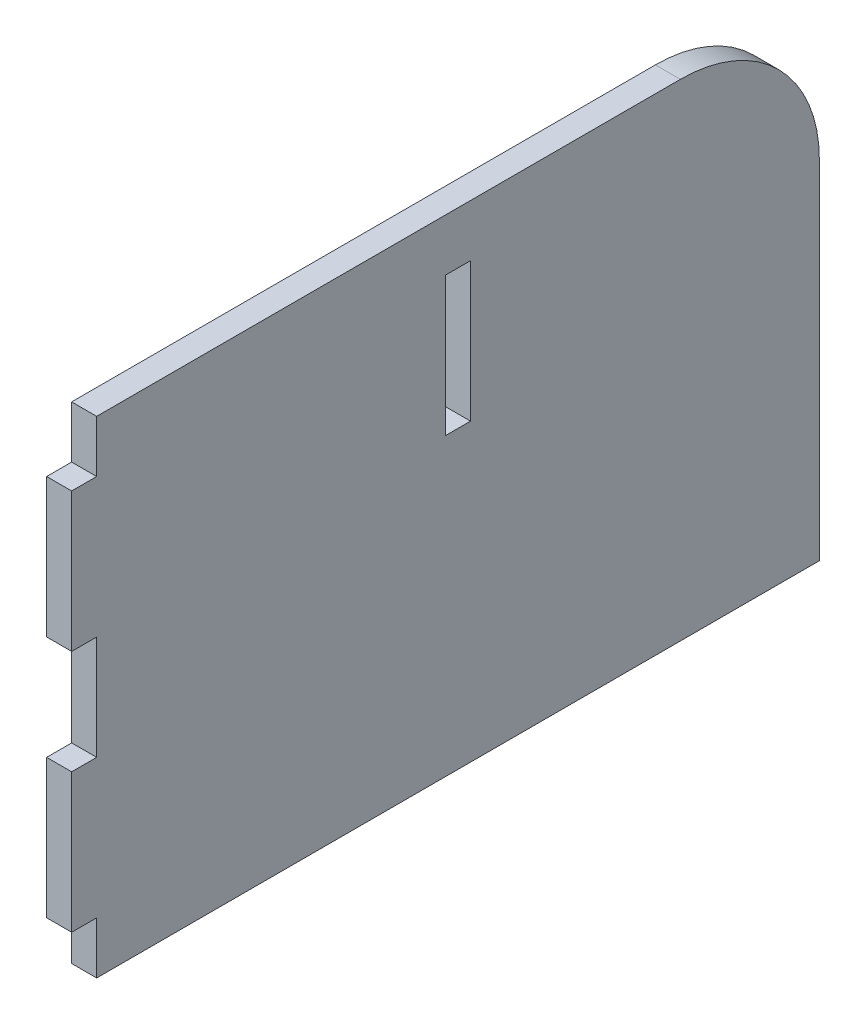
ISO-10303-21;
HEADER;
FILE_DESCRIPTION(('STEP AP214'),'2;1');
FILE_NAME('part.step','',(''),(''),'','','');
FILE_SCHEMA(('AUTOMOTIVE_DESIGN { 1 0 10303 214 1 1 1 1 }'));
ENDSEC;
DATA;
#1=APPLICATION_CONTEXT('core data for automotive mechanical design processes');
#2=APPLICATION_PROTOCOL_DEFINITION('international standard','automotive_design',2000,#1);
#3=PRODUCT_CONTEXT('',#1,'mechanical');
#4=PRODUCT('Part','Part','',(#3));
#5=PRODUCT_RELATED_PRODUCT_CATEGORY('part','',(#4));
#6=PRODUCT_DEFINITION_FORMATION('','',#4);
#7=PRODUCT_DEFINITION_CONTEXT('part definition',#1,'design');
#8=PRODUCT_DEFINITION('design','',#6,#7);
#9=PRODUCT_DEFINITION_SHAPE('','',#8);
#10=(LENGTH_UNIT() NAMED_UNIT(*) SI_UNIT(.MILLI.,.METRE.));
#11=(NAMED_UNIT(*) PLANE_ANGLE_UNIT() SI_UNIT($,.RADIAN.));
#12=(NAMED_UNIT(*) SI_UNIT($,.STERADIAN.) SOLID_ANGLE_UNIT());
#13=UNCERTAINTY_MEASURE_WITH_UNIT(LENGTH_MEASURE(1.E-05),#10,'distance_accuracy_value','');
#14=(GEOMETRIC_REPRESENTATION_CONTEXT(3) GLOBAL_UNCERTAINTY_ASSIGNED_CONTEXT((#13)) GLOBAL_UNIT_ASSIGNED_CONTEXT((#10,
#11,#12)) REPRESENTATION_CONTEXT('',''));
#15=CARTESIAN_POINT('',(0.,0.,0.));
#16=DIRECTION('',(0.,0.,1.));
#17=DIRECTION('',(1.,0.,0.));
#18=AXIS2_PLACEMENT_3D('',#15,#16,#17);
#19=CARTESIAN_POINT('',(18.,-100.,-420.));
#20=DIRECTION('',(1.,0.,0.));
#21=DIRECTION('',(0.,0.,-1.));
#22=AXIS2_PLACEMENT_3D('',#19,#20,#21);
#23=PLANE('',#22);
#24=DIRECTION('',(0.,-1.,0.));
#25=VECTOR('',#24,1.);
#26=CARTESIAN_POINT('',(18.,0.,0.));
#27=LINE('',#26,#25);
#28=CARTESIAN_POINT('',(18.,0.,0.));
#29=VERTEX_POINT('',#28);
#30=CARTESIAN_POINT('',(18.,-37.5,0.));
#31=VERTEX_POINT('',#30);
#32=EDGE_CURVE('E188',#29,#31,#27,.T.);
#33=ORIENTED_EDGE('',*,*,#32,.T.);
#34=DIRECTION('',(0.,0.,1.));
#35=VECTOR('',#34,1.);
#36=CARTESIAN_POINT('',(18.,-37.5,18.));
#37=LINE('',#36,#35);
#38=CARTESIAN_POINT('',(18.,-37.5,18.));
#39=VERTEX_POINT('',#38);
#40=EDGE_CURVE('E191',#31,#39,#37,.T.);
#41=ORIENTED_EDGE('',*,*,#40,.T.);
#42=DIRECTION('',(0.,-1.,0.));
#43=VECTOR('',#42,1.);
#44=CARTESIAN_POINT('',(18.,-37.5,18.));
#45=LINE('',#44,#43);
#46=CARTESIAN_POINT('',(18.,-137.5,18.));
#47=VERTEX_POINT('',#46);
#48=EDGE_CURVE('E194',#39,#47,#45,.T.);
#49=ORIENTED_EDGE('',*,*,#48,.T.);
#50=DIRECTION('',(0.,0.,-1.));
#51=VECTOR('',#50,1.);
#52=CARTESIAN_POINT('',(18.,-137.5,18.));
#53=LINE('',#52,#51);
#54=CARTESIAN_POINT('',(18.,-137.5,0.));
#55=VERTEX_POINT('',#54);
#56=EDGE_CURVE('E196',#47,#55,#53,.T.);
#57=ORIENTED_EDGE('',*,*,#56,.T.);
#58=DIRECTION('',(0.,-1.,0.));
#59=VECTOR('',#58,1.);
#60=CARTESIAN_POINT('',(18.,-137.5,0.));
#61=LINE('',#60,#59);
#62=CARTESIAN_POINT('',(18.,-212.5,0.));
#63=VERTEX_POINT('',#62);
#64=EDGE_CURVE('E198',#55,#63,#61,.T.);
#65=ORIENTED_EDGE('',*,*,#64,.T.);
#66=DIRECTION('',(0.,0.,1.));
#67=VECTOR('',#66,1.);
#68=CARTESIAN_POINT('',(18.,-212.5,18.));
#69=LINE('',#68,#67);
#70=CARTESIAN_POINT('',(18.,-212.5,18.));
#71=VERTEX_POINT('',#70);
#72=EDGE_CURVE('E200',#63,#71,#69,.T.);
#73=ORIENTED_EDGE('',*,*,#72,.T.);
#74=DIRECTION('',(0.,-1.,0.));
#75=VECTOR('',#74,1.);
#76=CARTESIAN_POINT('',(18.,-312.5,18.));
#77=LINE('',#76,#75);
#78=CARTESIAN_POINT('',(18.,-312.5,18.));
#79=VERTEX_POINT('',#78);
#80=EDGE_CURVE('E202',#71,#79,#77,.T.);
#81=ORIENTED_EDGE('',*,*,#80,.T.);
#82=DIRECTION('',(0.,0.,-1.));
#83=VECTOR('',#82,1.);
#84=CARTESIAN_POINT('',(18.,-312.5,18.));
#85=LINE('',#84,#83);
#86=CARTESIAN_POINT('',(18.,-312.5,0.));
#87=VERTEX_POINT('',#86);
#88=EDGE_CURVE('E204',#79,#87,#85,.T.);
#89=ORIENTED_EDGE('',*,*,#88,.T.);
#90=DIRECTION('',(0.,-1.,0.));
#91=VECTOR('',#90,1.);
#92=CARTESIAN_POINT('',(18.,-312.5,0.));
#93=LINE('',#92,#91);
#94=CARTESIAN_POINT('',(18.,-350.,0.));
#95=VERTEX_POINT('',#94);
#96=EDGE_CURVE('E206',#87,#95,#93,.T.);
#97=ORIENTED_EDGE('',*,*,#96,.T.);
#98=DIRECTION('',(0.,0.,-1.));
#99=VECTOR('',#98,1.);
#100=CARTESIAN_POINT('',(18.,-350.,0.));
#101=LINE('',#100,#99);
#102=CARTESIAN_POINT('',(18.,-350.,-520.));
#103=VERTEX_POINT('',#102);
#104=EDGE_CURVE('E208',#95,#103,#101,.T.);
#105=ORIENTED_EDGE('',*,*,#104,.T.);
#106=DIRECTION('',(0.,1.,0.));
#107=VECTOR('',#106,1.);
#108=CARTESIAN_POINT('',(18.,-100.,-520.));
#109=LINE('',#108,#107);
#110=CARTESIAN_POINT('',(18.,-100.,-520.));
#111=VERTEX_POINT('',#110);
#112=EDGE_CURVE('E210',#103,#111,#109,.T.);
#113=ORIENTED_EDGE('',*,*,#112,.T.);
#114=CARTESIAN_POINT('',(18.,-100.,-420.));
#115=DIRECTION('',(1.,0.,0.));
#116=DIRECTION('',(0.,0.,-1.));
#117=AXIS2_PLACEMENT_3D('',#114,#115,#116);
#118=CIRCLE('',#117,100.);
#119=CARTESIAN_POINT('',(18.,0.,-420.));
#120=VERTEX_POINT('',#119);
#121=EDGE_CURVE('E212',#111,#120,#118,.T.);
#122=ORIENTED_EDGE('',*,*,#121,.T.);
#123=DIRECTION('',(0.,0.,1.));
#124=VECTOR('',#123,1.);
#125=CARTESIAN_POINT('',(18.,0.,0.));
#126=LINE('',#125,#124);
#127=EDGE_CURVE('E214',#120,#29,#126,.T.);
#128=ORIENTED_EDGE('',*,*,#127,.T.);
#129=EDGE_LOOP('',(#33,#41,#49,#57,#65,#73,#81,#89,#97,#105,#113,#122,#128));
#130=FACE_BOUND('',#129,.T.);
#131=DIRECTION('',(0.,0.,1.));
#132=VECTOR('',#131,1.);
#133=CARTESIAN_POINT('',(18.,-37.5000000000001,-251.));
#134=LINE('',#133,#132);
#135=CARTESIAN_POINT('',(18.,-37.5000000000001,-269.));
#136=VERTEX_POINT('',#135);
#137=CARTESIAN_POINT('',(18.,-37.5000000000001,-251.));
#138=VERTEX_POINT('',#137);
#139=EDGE_CURVE('E160',#136,#138,#134,.T.);
#140=ORIENTED_EDGE('',*,*,#139,.F.);
#141=DIRECTION('',(0.,1.,0.));
#142=VECTOR('',#141,1.);
#143=CARTESIAN_POINT('',(18.,-37.5000000000001,-269.));
#144=LINE('',#143,#142);
#145=CARTESIAN_POINT('',(18.,-137.5,-269.));
#146=VERTEX_POINT('',#145);
#147=EDGE_CURVE('E152',#146,#136,#144,.T.);
#148=ORIENTED_EDGE('',*,*,#147,.F.);
#149=DIRECTION('',(0.,0.,-1.));
#150=VECTOR('',#149,1.);
#151=CARTESIAN_POINT('',(18.,-137.5,-251.));
#152=LINE('',#151,#150);
#153=CARTESIAN_POINT('',(18.,-137.5,-251.));
#154=VERTEX_POINT('',#153);
#155=EDGE_CURVE('E174',#154,#146,#152,.T.);
#156=ORIENTED_EDGE('',*,*,#155,.F.);
#157=DIRECTION('',(0.,-1.,0.));
#158=VECTOR('',#157,1.);
#159=CARTESIAN_POINT('',(18.,-37.5000000000001,-251.));
#160=LINE('',#159,#158);
#161=EDGE_CURVE('E172',#138,#154,#160,.T.);
#162=ORIENTED_EDGE('',*,*,#161,.F.);
#163=EDGE_LOOP('',(#140,#148,#156,#162));
#164=FACE_BOUND('',#163,.T.);
#165=ADVANCED_FACE('F33',(#130,#164),#23,.T.);
#166=CARTESIAN_POINT('',(0.,-100.,-420.));
#167=DIRECTION('',(1.,0.,0.));
#168=DIRECTION('',(0.,0.,-1.));
#169=AXIS2_PLACEMENT_3D('',#166,#167,#168);
#170=PLANE('',#169);
#171=DIRECTION('',(0.,-1.,0.));
#172=VECTOR('',#171,1.);
#173=CARTESIAN_POINT('',(0.,0.,0.));
#174=LINE('',#173,#172);
#175=CARTESIAN_POINT('',(0.,0.,0.));
#176=VERTEX_POINT('',#175);
#177=CARTESIAN_POINT('',(0.,-37.5,0.));
#178=VERTEX_POINT('',#177);
#179=EDGE_CURVE('E168',#176,#178,#174,.T.);
#180=ORIENTED_EDGE('',*,*,#179,.F.);
#181=DIRECTION('',(0.,0.,1.));
#182=VECTOR('',#181,1.);
#183=CARTESIAN_POINT('',(0.,0.,0.));
#184=LINE('',#183,#182);
#185=CARTESIAN_POINT('',(0.,0.,-420.));
#186=VERTEX_POINT('',#185);
#187=EDGE_CURVE('E192',#186,#176,#184,.T.);
#188=ORIENTED_EDGE('',*,*,#187,.F.);
#189=CARTESIAN_POINT('',(0.,-100.,-420.));
#190=DIRECTION('',(1.,0.,0.));
#191=DIRECTION('',(0.,0.,-1.));
#192=AXIS2_PLACEMENT_3D('',#189,#190,#191);
#193=CIRCLE('',#192,100.);
#194=CARTESIAN_POINT('',(0.,-100.,-520.));
#195=VERTEX_POINT('',#194);
#196=EDGE_CURVE('E239',#195,#186,#193,.T.);
#197=ORIENTED_EDGE('',*,*,#196,.F.);
#198=DIRECTION('',(0.,1.,0.));
#199=VECTOR('',#198,1.);
#200=CARTESIAN_POINT('',(0.,-100.,-520.));
#201=LINE('',#200,#199);
#202=CARTESIAN_POINT('',(0.,-350.,-520.));
#203=VERTEX_POINT('',#202);
#204=EDGE_CURVE('E237',#203,#195,#201,.T.);
#205=ORIENTED_EDGE('',*,*,#204,.F.);
#206=DIRECTION('',(0.,0.,-1.));
#207=VECTOR('',#206,1.);
#208=CARTESIAN_POINT('',(0.,-350.,0.));
#209=LINE('',#208,#207);
#210=CARTESIAN_POINT('',(0.,-350.,0.));
#211=VERTEX_POINT('',#210);
#212=EDGE_CURVE('E235',#211,#203,#209,.T.);
#213=ORIENTED_EDGE('',*,*,#212,.F.);
#214=DIRECTION('',(0.,-1.,0.));
#215=VECTOR('',#214,1.);
#216=CARTESIAN_POINT('',(0.,-312.5,0.));
#217=LINE('',#216,#215);
#218=CARTESIAN_POINT('',(0.,-312.5,0.));
#219=VERTEX_POINT('',#218);
#220=EDGE_CURVE('E233',#219,#211,#217,.T.);
#221=ORIENTED_EDGE('',*,*,#220,.F.);
#222=DIRECTION('',(0.,0.,-1.));
#223=VECTOR('',#222,1.);
#224=CARTESIAN_POINT('',(0.,-312.5,18.));
#225=LINE('',#224,#223);
#226=CARTESIAN_POINT('',(0.,-312.5,18.));
#227=VERTEX_POINT('',#226);
#228=EDGE_CURVE('E231',#227,#219,#225,.T.);
#229=ORIENTED_EDGE('',*,*,#228,.F.);
#230=DIRECTION('',(0.,-1.,0.));
#231=VECTOR('',#230,1.);
#232=CARTESIAN_POINT('',(0.,-312.5,18.));
#233=LINE('',#232,#231);
#234=CARTESIAN_POINT('',(0.,-212.5,18.));
#235=VERTEX_POINT('',#234);
#236=EDGE_CURVE('E229',#235,#227,#233,.T.);
#237=ORIENTED_EDGE('',*,*,#236,.F.);
#238=DIRECTION('',(0.,0.,1.));
#239=VECTOR('',#238,1.);
#240=CARTESIAN_POINT('',(0.,-212.5,18.));
#241=LINE('',#240,#239);
#242=CARTESIAN_POINT('',(0.,-212.5,0.));
#243=VERTEX_POINT('',#242);
#244=EDGE_CURVE('E227',#243,#235,#241,.T.);
#245=ORIENTED_EDGE('',*,*,#244,.F.);
#246=DIRECTION('',(0.,-1.,0.));
#247=VECTOR('',#246,1.);
#248=CARTESIAN_POINT('',(0.,-137.5,0.));
#249=LINE('',#248,#247);
#250=CARTESIAN_POINT('',(0.,-137.5,0.));
#251=VERTEX_POINT('',#250);
#252=EDGE_CURVE('E225',#251,#243,#249,.T.);
#253=ORIENTED_EDGE('',*,*,#252,.F.);
#254=DIRECTION('',(0.,0.,-1.));
#255=VECTOR('',#254,1.);
#256=CARTESIAN_POINT('',(0.,-137.5,18.));
#257=LINE('',#256,#255);
#258=CARTESIAN_POINT('',(0.,-137.5,18.));
#259=VERTEX_POINT('',#258);
#260=EDGE_CURVE('E223',#259,#251,#257,.T.);
#261=ORIENTED_EDGE('',*,*,#260,.F.);
#262=DIRECTION('',(0.,-1.,0.));
#263=VECTOR('',#262,1.);
#264=CARTESIAN_POINT('',(0.,-37.5,18.));
#265=LINE('',#264,#263);
#266=CARTESIAN_POINT('',(0.,-37.5,18.));
#267=VERTEX_POINT('',#266);
#268=EDGE_CURVE('E221',#267,#259,#265,.T.);
#269=ORIENTED_EDGE('',*,*,#268,.F.);
#270=DIRECTION('',(0.,0.,1.));
#271=VECTOR('',#270,1.);
#272=CARTESIAN_POINT('',(0.,-37.5,18.));
#273=LINE('',#272,#271);
#274=EDGE_CURVE('E219',#178,#267,#273,.T.);
#275=ORIENTED_EDGE('',*,*,#274,.F.);
#276=EDGE_LOOP('',(#180,#188,#197,#205,#213,#221,#229,#237,#245,#253,#261,#269,#275));
#277=FACE_BOUND('',#276,.T.);
#278=DIRECTION('',(0.,1.,0.));
#279=VECTOR('',#278,1.);
#280=CARTESIAN_POINT('',(0.,-37.5000000000001,-269.));
#281=LINE('',#280,#279);
#282=CARTESIAN_POINT('',(0.,-137.5,-269.));
#283=VERTEX_POINT('',#282);
#284=CARTESIAN_POINT('',(0.,-37.5000000000001,-269.));
#285=VERTEX_POINT('',#284);
#286=EDGE_CURVE('E56',#283,#285,#281,.T.);
#287=ORIENTED_EDGE('',*,*,#286,.T.);
#288=DIRECTION('',(0.,0.,1.));
#289=VECTOR('',#288,1.);
#290=CARTESIAN_POINT('',(0.,-37.5000000000001,-251.));
#291=LINE('',#290,#289);
#292=CARTESIAN_POINT('',(0.,-37.5000000000001,-251.));
#293=VERTEX_POINT('',#292);
#294=EDGE_CURVE('E167',#285,#293,#291,.T.);
#295=ORIENTED_EDGE('',*,*,#294,.T.);
#296=DIRECTION('',(0.,-1.,0.));
#297=VECTOR('',#296,1.);
#298=CARTESIAN_POINT('',(0.,-37.5000000000001,-251.));
#299=LINE('',#298,#297);
#300=CARTESIAN_POINT('',(0.,-137.5,-251.));
#301=VERTEX_POINT('',#300);
#302=EDGE_CURVE('E180',#293,#301,#299,.T.);
#303=ORIENTED_EDGE('',*,*,#302,.T.);
#304=DIRECTION('',(0.,0.,-1.));
#305=VECTOR('',#304,1.);
#306=CARTESIAN_POINT('',(0.,-137.5,-251.));
#307=LINE('',#306,#305);
#308=EDGE_CURVE('E161',#301,#283,#307,.T.);
#309=ORIENTED_EDGE('',*,*,#308,.T.);
#310=EDGE_LOOP('',(#287,#295,#303,#309));
#311=FACE_BOUND('',#310,.T.);
#312=ADVANCED_FACE('F284',(#277,#311),#170,.F.);
#313=CARTESIAN_POINT('',(18.,0.,0.));
#314=DIRECTION('',(0.,0.,-1.));
#315=DIRECTION('',(0.,1.,0.));
#316=AXIS2_PLACEMENT_3D('',#313,#314,#315);
#317=PLANE('',#316);
#318=ORIENTED_EDGE('',*,*,#179,.T.);
#319=DIRECTION('',(-1.,0.,0.));
#320=VECTOR('',#319,1.);
#321=CARTESIAN_POINT('',(18.,-37.5,0.));
#322=LINE('',#321,#320);
#323=EDGE_CURVE('E11',#31,#178,#322,.T.);
#324=ORIENTED_EDGE('',*,*,#323,.F.);
#325=ORIENTED_EDGE('',*,*,#32,.F.);
#326=DIRECTION('',(-1.,0.,0.));
#327=VECTOR('',#326,1.);
#328=CARTESIAN_POINT('',(18.,0.,0.));
#329=LINE('',#328,#327);
#330=EDGE_CURVE('E216',#29,#176,#329,.T.);
#331=ORIENTED_EDGE('',*,*,#330,.T.);
#332=EDGE_LOOP('',(#318,#324,#325,#331));
#333=FACE_BOUND('',#332,.T.);
#334=ADVANCED_FACE('F35',(#333),#317,.F.);
#335=CARTESIAN_POINT('',(18.,-37.5,18.));
#336=DIRECTION('',(0.,-1.,0.));
#337=DIRECTION('',(0.,0.,-1.));
#338=AXIS2_PLACEMENT_3D('',#335,#336,#337);
#339=PLANE('',#338);
#340=ORIENTED_EDGE('',*,*,#274,.T.);
#341=DIRECTION('',(-1.,0.,0.));
#342=VECTOR('',#341,1.);
#343=CARTESIAN_POINT('',(18.,-37.5,18.));
#344=LINE('',#343,#342);
#345=EDGE_CURVE('E41',#39,#267,#344,.T.);
#346=ORIENTED_EDGE('',*,*,#345,.F.);
#347=ORIENTED_EDGE('',*,*,#40,.F.);
#348=ORIENTED_EDGE('',*,*,#323,.T.);
#349=EDGE_LOOP('',(#340,#346,#347,#348));
#350=FACE_BOUND('',#349,.T.);
#351=ADVANCED_FACE('F301',(#350),#339,.F.);
#352=CARTESIAN_POINT('',(18.,-37.5,18.));
#353=DIRECTION('',(0.,0.,-1.));
#354=DIRECTION('',(0.,1.,0.));
#355=AXIS2_PLACEMENT_3D('',#352,#353,#354);
#356=PLANE('',#355);
#357=ORIENTED_EDGE('',*,*,#268,.T.);
#358=DIRECTION('',(-1.,0.,0.));
#359=VECTOR('',#358,1.);
#360=CARTESIAN_POINT('',(18.,-137.5,18.));
#361=LINE('',#360,#359);
#362=EDGE_CURVE('E271',#47,#259,#361,.T.);
#363=ORIENTED_EDGE('',*,*,#362,.F.);
#364=ORIENTED_EDGE('',*,*,#48,.F.);
#365=ORIENTED_EDGE('',*,*,#345,.T.);
#366=EDGE_LOOP('',(#357,#363,#364,#365));
#367=FACE_BOUND('',#366,.T.);
#368=ADVANCED_FACE('F278',(#367),#356,.F.);
#369=CARTESIAN_POINT('',(18.,-137.5,18.));
#370=DIRECTION('',(0.,1.,0.));
#371=DIRECTION('',(0.,0.,1.));
#372=AXIS2_PLACEMENT_3D('',#369,#370,#371);
#373=PLANE('',#372);
#374=ORIENTED_EDGE('',*,*,#260,.T.);
#375=DIRECTION('',(-1.,0.,0.));
#376=VECTOR('',#375,1.);
#377=CARTESIAN_POINT('',(18.,-137.5,0.));
#378=LINE('',#377,#376);
#379=EDGE_CURVE('E268',#55,#251,#378,.T.);
#380=ORIENTED_EDGE('',*,*,#379,.F.);
#381=ORIENTED_EDGE('',*,*,#56,.F.);
#382=ORIENTED_EDGE('',*,*,#362,.T.);
#383=EDGE_LOOP('',(#374,#380,#381,#382));
#384=FACE_BOUND('',#383,.T.);
#385=ADVANCED_FACE('F290',(#384),#373,.F.);
#386=CARTESIAN_POINT('',(18.,-137.5,0.));
#387=DIRECTION('',(0.,0.,-1.));
#388=DIRECTION('',(-1.,0.,0.));
#389=AXIS2_PLACEMENT_3D('',#386,#387,#388);
#390=PLANE('',#389);
#391=ORIENTED_EDGE('',*,*,#252,.T.);
#392=DIRECTION('',(-1.,0.,0.));
#393=VECTOR('',#392,1.);
#394=CARTESIAN_POINT('',(18.,-212.5,0.));
#395=LINE('',#394,#393);
#396=EDGE_CURVE('E265',#63,#243,#395,.T.);
#397=ORIENTED_EDGE('',*,*,#396,.F.);
#398=ORIENTED_EDGE('',*,*,#64,.F.);
#399=ORIENTED_EDGE('',*,*,#379,.T.);
#400=EDGE_LOOP('',(#391,#397,#398,#399));
#401=FACE_BOUND('',#400,.T.);
#402=ADVANCED_FACE('F294',(#401),#390,.F.);
#403=CARTESIAN_POINT('',(18.,-212.5,18.));
#404=DIRECTION('',(0.,-1.,0.));
#405=DIRECTION('',(0.,0.,-1.));
#406=AXIS2_PLACEMENT_3D('',#403,#404,#405);
#407=PLANE('',#406);
#408=ORIENTED_EDGE('',*,*,#244,.T.);
#409=DIRECTION('',(-1.,0.,0.));
#410=VECTOR('',#409,1.);
#411=CARTESIAN_POINT('',(18.,-212.5,18.));
#412=LINE('',#411,#410);
#413=EDGE_CURVE('E262',#71,#235,#412,.T.);
#414=ORIENTED_EDGE('',*,*,#413,.F.);
#415=ORIENTED_EDGE('',*,*,#72,.F.);
#416=ORIENTED_EDGE('',*,*,#396,.T.);
#417=EDGE_LOOP('',(#408,#414,#415,#416));
#418=FACE_BOUND('',#417,.T.);
#419=ADVANCED_FACE('F339',(#418),#407,.F.);
#420=CARTESIAN_POINT('',(18.,-312.5,18.));
#421=DIRECTION('',(0.,0.,-1.));
#422=DIRECTION('',(0.,1.,0.));
#423=AXIS2_PLACEMENT_3D('',#420,#421,#422);
#424=PLANE('',#423);
#425=ORIENTED_EDGE('',*,*,#236,.T.);
#426=DIRECTION('',(-1.,0.,0.));
#427=VECTOR('',#426,1.);
#428=CARTESIAN_POINT('',(18.,-312.5,18.));
#429=LINE('',#428,#427);
#430=EDGE_CURVE('E259',#79,#227,#429,.T.);
#431=ORIENTED_EDGE('',*,*,#430,.F.);
#432=ORIENTED_EDGE('',*,*,#80,.F.);
#433=ORIENTED_EDGE('',*,*,#413,.T.);
#434=EDGE_LOOP('',(#425,#431,#432,#433));
#435=FACE_BOUND('',#434,.T.);
#436=ADVANCED_FACE('F336',(#435),#424,.F.);
#437=CARTESIAN_POINT('',(18.,-312.5,18.));
#438=DIRECTION('',(0.,1.,0.));
#439=DIRECTION('',(0.,0.,1.));
#440=AXIS2_PLACEMENT_3D('',#437,#438,#439);
#441=PLANE('',#440);
#442=ORIENTED_EDGE('',*,*,#228,.T.);
#443=DIRECTION('',(-1.,0.,0.));
#444=VECTOR('',#443,1.);
#445=CARTESIAN_POINT('',(18.,-312.5,0.));
#446=LINE('',#445,#444);
#447=EDGE_CURVE('E256',#87,#219,#446,.T.);
#448=ORIENTED_EDGE('',*,*,#447,.F.);
#449=ORIENTED_EDGE('',*,*,#88,.F.);
#450=ORIENTED_EDGE('',*,*,#430,.T.);
#451=EDGE_LOOP('',(#442,#448,#449,#450));
#452=FACE_BOUND('',#451,.T.);
#453=ADVANCED_FACE('F332',(#452),#441,.F.);
#454=CARTESIAN_POINT('',(18.,-312.5,0.));
#455=DIRECTION('',(0.,0.,-1.));
#456=DIRECTION('',(0.,1.,0.));
#457=AXIS2_PLACEMENT_3D('',#454,#455,#456);
#458=PLANE('',#457);
#459=ORIENTED_EDGE('',*,*,#220,.T.);
#460=DIRECTION('',(-1.,0.,0.));
#461=VECTOR('',#460,1.);
#462=CARTESIAN_POINT('',(18.,-350.,0.));
#463=LINE('',#462,#461);
#464=EDGE_CURVE('E253',#95,#211,#463,.T.);
#465=ORIENTED_EDGE('',*,*,#464,.F.);
#466=ORIENTED_EDGE('',*,*,#96,.F.);
#467=ORIENTED_EDGE('',*,*,#447,.T.);
#468=EDGE_LOOP('',(#459,#465,#466,#467));
#469=FACE_BOUND('',#468,.T.);
#470=ADVANCED_FACE('F328',(#469),#458,.F.);
#471=CARTESIAN_POINT('',(18.,-350.,0.));
#472=DIRECTION('',(0.,1.,0.));
#473=DIRECTION('',(0.,0.,1.));
#474=AXIS2_PLACEMENT_3D('',#471,#472,#473);
#475=PLANE('',#474);
#476=ORIENTED_EDGE('',*,*,#212,.T.);
#477=DIRECTION('',(-1.,0.,0.));
#478=VECTOR('',#477,1.);
#479=CARTESIAN_POINT('',(18.,-350.,-520.));
#480=LINE('',#479,#478);
#481=EDGE_CURVE('E250',#103,#203,#480,.T.);
#482=ORIENTED_EDGE('',*,*,#481,.F.);
#483=ORIENTED_EDGE('',*,*,#104,.F.);
#484=ORIENTED_EDGE('',*,*,#464,.T.);
#485=EDGE_LOOP('',(#476,#482,#483,#484));
#486=FACE_BOUND('',#485,.T.);
#487=ADVANCED_FACE('F323',(#486),#475,.F.);
#488=CARTESIAN_POINT('',(18.,-100.,-520.));
#489=DIRECTION('',(0.,0.,1.));
#490=DIRECTION('',(1.,0.,0.));
#491=AXIS2_PLACEMENT_3D('',#488,#489,#490);
#492=PLANE('',#491);
#493=ORIENTED_EDGE('',*,*,#204,.T.);
#494=DIRECTION('',(-1.,0.,0.));
#495=VECTOR('',#494,1.);
#496=CARTESIAN_POINT('',(18.,-100.,-520.));
#497=LINE('',#496,#495);
#498=EDGE_CURVE('E247',#111,#195,#497,.T.);
#499=ORIENTED_EDGE('',*,*,#498,.F.);
#500=ORIENTED_EDGE('',*,*,#112,.F.);
#501=ORIENTED_EDGE('',*,*,#481,.T.);
#502=EDGE_LOOP('',(#493,#499,#500,#501));
#503=FACE_BOUND('',#502,.T.);
#504=ADVANCED_FACE('F317',(#503),#492,.F.);
#505=CARTESIAN_POINT('',(18.,-100.,-420.));
#506=DIRECTION('',(-1.,0.,0.));
#507=DIRECTION('',(0.,0.,1.));
#508=AXIS2_PLACEMENT_3D('',#505,#506,#507);
#509=CYLINDRICAL_SURFACE('',#508,100.);
#510=ORIENTED_EDGE('',*,*,#196,.T.);
#511=DIRECTION('',(-1.,0.,0.));
#512=VECTOR('',#511,1.);
#513=CARTESIAN_POINT('',(18.,0.,-420.));
#514=LINE('',#513,#512);
#515=EDGE_CURVE('E244',#120,#186,#514,.T.);
#516=ORIENTED_EDGE('',*,*,#515,.F.);
#517=ORIENTED_EDGE('',*,*,#121,.F.);
#518=ORIENTED_EDGE('',*,*,#498,.T.);
#519=EDGE_LOOP('',(#510,#516,#517,#518));
#520=FACE_BOUND('',#519,.T.);
#521=ADVANCED_FACE('F313',(#520),#509,.T.);
#522=CARTESIAN_POINT('',(18.,0.,0.));
#523=DIRECTION('',(0.,-1.,0.));
#524=DIRECTION('',(0.,0.,-1.));
#525=AXIS2_PLACEMENT_3D('',#522,#523,#524);
#526=PLANE('',#525);
#527=ORIENTED_EDGE('',*,*,#187,.T.);
#528=ORIENTED_EDGE('',*,*,#330,.F.);
#529=ORIENTED_EDGE('',*,*,#127,.F.);
#530=ORIENTED_EDGE('',*,*,#515,.T.);
#531=EDGE_LOOP('',(#527,#528,#529,#530));
#532=FACE_BOUND('',#531,.T.);
#533=ADVANCED_FACE('F308',(#532),#526,.F.);
#534=CARTESIAN_POINT('',(18.,-37.5000000000001,-269.));
#535=DIRECTION('',(0.,0.,1.));
#536=DIRECTION('',(1.,0.,0.));
#537=AXIS2_PLACEMENT_3D('',#534,#535,#536);
#538=PLANE('',#537);
#539=ORIENTED_EDGE('',*,*,#286,.F.);
#540=DIRECTION('',(-1.,0.,0.));
#541=VECTOR('',#540,1.);
#542=CARTESIAN_POINT('',(18.,-137.5,-269.));
#543=LINE('',#542,#541);
#544=EDGE_CURVE('E156',#146,#283,#543,.T.);
#545=ORIENTED_EDGE('',*,*,#544,.F.);
#546=ORIENTED_EDGE('',*,*,#147,.T.);
#547=DIRECTION('',(-1.,0.,0.));
#548=VECTOR('',#547,1.);
#549=CARTESIAN_POINT('',(18.,-37.5000000000001,-269.));
#550=LINE('',#549,#548);
#551=EDGE_CURVE('E155',#136,#285,#550,.T.);
#552=ORIENTED_EDGE('',*,*,#551,.T.);
#553=EDGE_LOOP('',(#539,#545,#546,#552));
#554=FACE_BOUND('',#553,.T.);
#555=ADVANCED_FACE('F154',(#554),#538,.T.);
#556=CARTESIAN_POINT('',(18.,-37.5000000000001,-251.));
#557=DIRECTION('',(0.,-1.,0.));
#558=DIRECTION('',(0.,0.,-1.));
#559=AXIS2_PLACEMENT_3D('',#556,#557,#558);
#560=PLANE('',#559);
#561=ORIENTED_EDGE('',*,*,#294,.F.);
#562=ORIENTED_EDGE('',*,*,#551,.F.);
#563=ORIENTED_EDGE('',*,*,#139,.T.);
#564=DIRECTION('',(-1.,0.,0.));
#565=VECTOR('',#564,1.);
#566=CARTESIAN_POINT('',(18.,-37.5000000000001,-251.));
#567=LINE('',#566,#565);
#568=EDGE_CURVE('E169',#138,#293,#567,.T.);
#569=ORIENTED_EDGE('',*,*,#568,.T.);
#570=EDGE_LOOP('',(#561,#562,#563,#569));
#571=FACE_BOUND('',#570,.T.);
#572=ADVANCED_FACE('F164',(#571),#560,.T.);
#573=CARTESIAN_POINT('',(18.,-37.5000000000001,-251.));
#574=DIRECTION('',(0.,0.,-1.));
#575=DIRECTION('',(0.,1.,0.));
#576=AXIS2_PLACEMENT_3D('',#573,#574,#575);
#577=PLANE('',#576);
#578=ORIENTED_EDGE('',*,*,#302,.F.);
#579=ORIENTED_EDGE('',*,*,#568,.F.);
#580=ORIENTED_EDGE('',*,*,#161,.T.);
#581=DIRECTION('',(-1.,0.,0.));
#582=VECTOR('',#581,1.);
#583=CARTESIAN_POINT('',(18.,-137.5,-251.));
#584=LINE('',#583,#582);
#585=EDGE_CURVE('E48',#154,#301,#584,.T.);
#586=ORIENTED_EDGE('',*,*,#585,.T.);
#587=EDGE_LOOP('',(#578,#579,#580,#586));
#588=FACE_BOUND('',#587,.T.);
#589=ADVANCED_FACE('F403',(#588),#577,.T.);
#590=CARTESIAN_POINT('',(18.,-137.5,-251.));
#591=DIRECTION('',(0.,1.,0.));
#592=DIRECTION('',(0.,0.,1.));
#593=AXIS2_PLACEMENT_3D('',#590,#591,#592);
#594=PLANE('',#593);
#595=ORIENTED_EDGE('',*,*,#308,.F.);
#596=ORIENTED_EDGE('',*,*,#585,.F.);
#597=ORIENTED_EDGE('',*,*,#155,.T.);
#598=ORIENTED_EDGE('',*,*,#544,.T.);
#599=EDGE_LOOP('',(#595,#596,#597,#598));
#600=FACE_BOUND('',#599,.T.);
#601=ADVANCED_FACE('F409',(#600),#594,.T.);
#602=CLOSED_SHELL('',(#165,#312,#334,#351,#368,#385,#402,#419,#436,#453,#470,#487,#504,#521,
#533,#555,#572,#589,#601));
#603=MANIFOLD_SOLID_BREP('B2',#602);
#604=ADVANCED_BREP_SHAPE_REPRESENTATION('',(#18,#603),#14);
#605=SHAPE_DEFINITION_REPRESENTATION(#9,#604);
ENDSEC;
END-ISO-10303-21;
